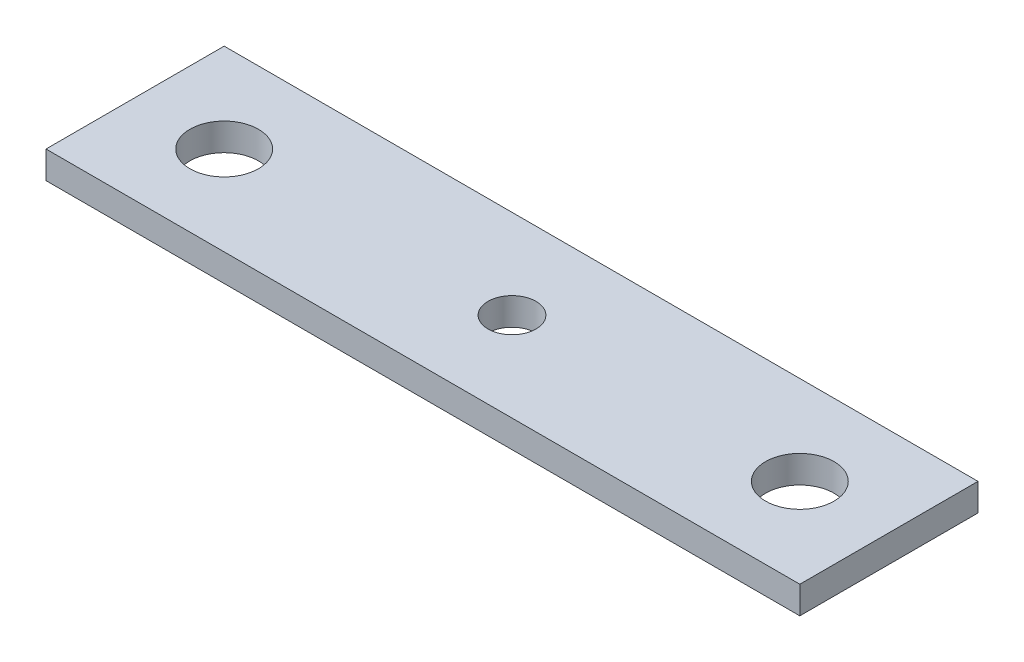
ISO-10303-21;
HEADER;
FILE_DESCRIPTION(('STEP AP214'),'2;1');
FILE_NAME('part.step','',(''),(''),'','','');
FILE_SCHEMA(('AUTOMOTIVE_DESIGN { 1 0 10303 214 1 1 1 1 }'));
ENDSEC;
DATA;
#1=APPLICATION_CONTEXT('core data for automotive mechanical design processes');
#2=APPLICATION_PROTOCOL_DEFINITION('international standard','automotive_design',2000,#1);
#3=PRODUCT_CONTEXT('',#1,'mechanical');
#4=PRODUCT('Part','Part','',(#3));
#5=PRODUCT_RELATED_PRODUCT_CATEGORY('part','',(#4));
#6=PRODUCT_DEFINITION_FORMATION('','',#4);
#7=PRODUCT_DEFINITION_CONTEXT('part definition',#1,'design');
#8=PRODUCT_DEFINITION('design','',#6,#7);
#9=PRODUCT_DEFINITION_SHAPE('','',#8);
#10=(LENGTH_UNIT() NAMED_UNIT(*) SI_UNIT(.MILLI.,.METRE.));
#11=(NAMED_UNIT(*) PLANE_ANGLE_UNIT() SI_UNIT($,.RADIAN.));
#12=(NAMED_UNIT(*) SI_UNIT($,.STERADIAN.) SOLID_ANGLE_UNIT());
#13=UNCERTAINTY_MEASURE_WITH_UNIT(LENGTH_MEASURE(1.E-05),#10,'distance_accuracy_value','');
#14=(GEOMETRIC_REPRESENTATION_CONTEXT(3) GLOBAL_UNCERTAINTY_ASSIGNED_CONTEXT((#13)) GLOBAL_UNIT_ASSIGNED_CONTEXT((#10,
#11,#12)) REPRESENTATION_CONTEXT('',''));
#15=CARTESIAN_POINT('',(0.,0.,0.));
#16=DIRECTION('',(0.,0.,1.));
#17=DIRECTION('',(1.,0.,0.));
#18=AXIS2_PLACEMENT_3D('',#15,#16,#17);
#19=CARTESIAN_POINT('',(0.,2.,0.));
#20=DIRECTION('',(0.,1.,0.));
#21=DIRECTION('',(0.,0.,1.));
#22=AXIS2_PLACEMENT_3D('',#19,#20,#21);
#23=PLANE('',#22);
#24=CARTESIAN_POINT('',(21.,2.,0.));
#25=DIRECTION('',(0.,1.,0.));
#26=DIRECTION('',(0.,0.,1.));
#27=AXIS2_PLACEMENT_3D('',#24,#25,#26);
#28=CIRCLE('',#27,2.5);
#29=CARTESIAN_POINT('',(21.,2.,2.5));
#30=VERTEX_POINT('',#29);
#31=EDGE_CURVE('E138',#30,#30,#28,.T.);
#32=ORIENTED_EDGE('',*,*,#31,.F.);
#33=EDGE_LOOP('',(#32));
#34=FACE_BOUND('',#33,.T.);
#35=DIRECTION('',(0.,0.,-1.));
#36=VECTOR('',#35,1.);
#37=CARTESIAN_POINT('',(27.5,2.,-6.5));
#38=LINE('',#37,#36);
#39=CARTESIAN_POINT('',(27.5,2.,6.5));
#40=VERTEX_POINT('',#39);
#41=CARTESIAN_POINT('',(27.5,2.,-6.5));
#42=VERTEX_POINT('',#41);
#43=EDGE_CURVE('E96',#40,#42,#38,.T.);
#44=ORIENTED_EDGE('',*,*,#43,.T.);
#45=DIRECTION('',(-1.,0.,0.));
#46=VECTOR('',#45,1.);
#47=CARTESIAN_POINT('',(-27.5,2.,-6.5));
#48=LINE('',#47,#46);
#49=CARTESIAN_POINT('',(-27.5,2.,-6.5));
#50=VERTEX_POINT('',#49);
#51=EDGE_CURVE('E91',#42,#50,#48,.T.);
#52=ORIENTED_EDGE('',*,*,#51,.T.);
#53=DIRECTION('',(0.,0.,1.));
#54=VECTOR('',#53,1.);
#55=CARTESIAN_POINT('',(-27.5,2.,-6.5));
#56=LINE('',#55,#54);
#57=CARTESIAN_POINT('',(-27.5,2.,6.5));
#58=VERTEX_POINT('',#57);
#59=EDGE_CURVE('E94',#50,#58,#56,.T.);
#60=ORIENTED_EDGE('',*,*,#59,.T.);
#61=DIRECTION('',(1.,0.,0.));
#62=VECTOR('',#61,1.);
#63=CARTESIAN_POINT('',(-27.5,2.,6.5));
#64=LINE('',#63,#62);
#65=EDGE_CURVE('E61',#58,#40,#64,.T.);
#66=ORIENTED_EDGE('',*,*,#65,.T.);
#67=EDGE_LOOP('',(#44,#52,#60,#66));
#68=FACE_BOUND('',#67,.T.);
#69=CARTESIAN_POINT('',(-21.,2.,0.));
#70=DIRECTION('',(0.,1.,0.));
#71=DIRECTION('',(0.,0.,1.));
#72=AXIS2_PLACEMENT_3D('',#69,#70,#71);
#73=CIRCLE('',#72,2.5);
#74=CARTESIAN_POINT('',(-21.,2.,2.5));
#75=VERTEX_POINT('',#74);
#76=EDGE_CURVE('E116',#75,#75,#73,.T.);
#77=ORIENTED_EDGE('',*,*,#76,.F.);
#78=EDGE_LOOP('',(#77));
#79=FACE_BOUND('',#78,.T.);
#80=CARTESIAN_POINT('',(0.,2.,0.));
#81=DIRECTION('',(0.,1.,0.));
#82=DIRECTION('',(0.,0.,1.));
#83=AXIS2_PLACEMENT_3D('',#80,#81,#82);
#84=CIRCLE('',#83,1.75);
#85=CARTESIAN_POINT('',(0.,2.,1.75));
#86=VERTEX_POINT('',#85);
#87=EDGE_CURVE('E146',#86,#86,#84,.T.);
#88=ORIENTED_EDGE('',*,*,#87,.F.);
#89=EDGE_LOOP('',(#88));
#90=FACE_BOUND('',#89,.T.);
#91=ADVANCED_FACE('F43',(#34,#68,#79,#90),#23,.T.);
#92=CARTESIAN_POINT('',(0.,0.,0.));
#93=DIRECTION('',(0.,1.,0.));
#94=DIRECTION('',(0.,0.,1.));
#95=AXIS2_PLACEMENT_3D('',#92,#93,#94);
#96=PLANE('',#95);
#97=DIRECTION('',(0.,0.,-1.));
#98=VECTOR('',#97,1.);
#99=CARTESIAN_POINT('',(27.5,0.,-6.5));
#100=LINE('',#99,#98);
#101=CARTESIAN_POINT('',(27.5,0.,6.5));
#102=VERTEX_POINT('',#101);
#103=CARTESIAN_POINT('',(27.5,0.,-6.5));
#104=VERTEX_POINT('',#103);
#105=EDGE_CURVE('E112',#102,#104,#100,.T.);
#106=ORIENTED_EDGE('',*,*,#105,.F.);
#107=DIRECTION('',(1.,0.,0.));
#108=VECTOR('',#107,1.);
#109=CARTESIAN_POINT('',(-27.5,0.,6.5));
#110=LINE('',#109,#108);
#111=CARTESIAN_POINT('',(-27.5,0.,6.5));
#112=VERTEX_POINT('',#111);
#113=EDGE_CURVE('E84',#112,#102,#110,.T.);
#114=ORIENTED_EDGE('',*,*,#113,.F.);
#115=DIRECTION('',(0.,0.,1.));
#116=VECTOR('',#115,1.);
#117=CARTESIAN_POINT('',(-27.5,0.,-6.5));
#118=LINE('',#117,#116);
#119=CARTESIAN_POINT('',(-27.5,0.,-6.5));
#120=VERTEX_POINT('',#119);
#121=EDGE_CURVE('E78',#120,#112,#118,.T.);
#122=ORIENTED_EDGE('',*,*,#121,.F.);
#123=DIRECTION('',(-1.,0.,0.));
#124=VECTOR('',#123,1.);
#125=CARTESIAN_POINT('',(-27.5,0.,-6.5));
#126=LINE('',#125,#124);
#127=EDGE_CURVE('E101',#104,#120,#126,.T.);
#128=ORIENTED_EDGE('',*,*,#127,.F.);
#129=EDGE_LOOP('',(#106,#114,#122,#128));
#130=FACE_BOUND('',#129,.T.);
#131=CARTESIAN_POINT('',(-21.,0.,0.));
#132=DIRECTION('',(0.,1.,0.));
#133=DIRECTION('',(0.,0.,1.));
#134=AXIS2_PLACEMENT_3D('',#131,#132,#133);
#135=CIRCLE('',#134,2.5);
#136=CARTESIAN_POINT('',(-21.,0.,2.5));
#137=VERTEX_POINT('',#136);
#138=EDGE_CURVE('E134',#137,#137,#135,.T.);
#139=ORIENTED_EDGE('',*,*,#138,.T.);
#140=EDGE_LOOP('',(#139));
#141=FACE_BOUND('',#140,.T.);
#142=CARTESIAN_POINT('',(21.,0.,0.));
#143=DIRECTION('',(0.,1.,0.));
#144=DIRECTION('',(0.,0.,1.));
#145=AXIS2_PLACEMENT_3D('',#142,#143,#144);
#146=CIRCLE('',#145,2.5);
#147=CARTESIAN_POINT('',(21.,0.,2.5));
#148=VERTEX_POINT('',#147);
#149=EDGE_CURVE('E142',#148,#148,#146,.T.);
#150=ORIENTED_EDGE('',*,*,#149,.T.);
#151=EDGE_LOOP('',(#150));
#152=FACE_BOUND('',#151,.T.);
#153=CARTESIAN_POINT('',(0.,0.,0.));
#154=DIRECTION('',(0.,1.,0.));
#155=DIRECTION('',(0.,0.,1.));
#156=AXIS2_PLACEMENT_3D('',#153,#154,#155);
#157=CIRCLE('',#156,1.75);
#158=CARTESIAN_POINT('',(0.,0.,1.75));
#159=VERTEX_POINT('',#158);
#160=EDGE_CURVE('E150',#159,#159,#157,.T.);
#161=ORIENTED_EDGE('',*,*,#160,.T.);
#162=EDGE_LOOP('',(#161));
#163=FACE_BOUND('',#162,.T.);
#164=ADVANCED_FACE('F129',(#130,#141,#152,#163),#96,.F.);
#165=CARTESIAN_POINT('',(27.5,2.,-6.5));
#166=DIRECTION('',(-1.,0.,0.));
#167=DIRECTION('',(0.,0.,1.));
#168=AXIS2_PLACEMENT_3D('',#165,#166,#167);
#169=PLANE('',#168);
#170=ORIENTED_EDGE('',*,*,#105,.T.);
#171=DIRECTION('',(0.,-1.,0.));
#172=VECTOR('',#171,1.);
#173=CARTESIAN_POINT('',(27.5,2.,-6.5));
#174=LINE('',#173,#172);
#175=EDGE_CURVE('E11',#42,#104,#174,.T.);
#176=ORIENTED_EDGE('',*,*,#175,.F.);
#177=ORIENTED_EDGE('',*,*,#43,.F.);
#178=DIRECTION('',(0.,-1.,0.));
#179=VECTOR('',#178,1.);
#180=CARTESIAN_POINT('',(27.5,2.,6.5));
#181=LINE('',#180,#179);
#182=EDGE_CURVE('E108',#40,#102,#181,.T.);
#183=ORIENTED_EDGE('',*,*,#182,.T.);
#184=EDGE_LOOP('',(#170,#176,#177,#183));
#185=FACE_BOUND('',#184,.T.);
#186=ADVANCED_FACE('F45',(#185),#169,.F.);
#187=CARTESIAN_POINT('',(-27.5,2.,-6.5));
#188=DIRECTION('',(0.,0.,1.));
#189=DIRECTION('',(1.,0.,0.));
#190=AXIS2_PLACEMENT_3D('',#187,#188,#189);
#191=PLANE('',#190);
#192=ORIENTED_EDGE('',*,*,#127,.T.);
#193=DIRECTION('',(0.,-1.,0.));
#194=VECTOR('',#193,1.);
#195=CARTESIAN_POINT('',(-27.5,2.,-6.5));
#196=LINE('',#195,#194);
#197=EDGE_CURVE('E53',#50,#120,#196,.T.);
#198=ORIENTED_EDGE('',*,*,#197,.F.);
#199=ORIENTED_EDGE('',*,*,#51,.F.);
#200=ORIENTED_EDGE('',*,*,#175,.T.);
#201=EDGE_LOOP('',(#192,#198,#199,#200));
#202=FACE_BOUND('',#201,.T.);
#203=ADVANCED_FACE('F100',(#202),#191,.F.);
#204=CARTESIAN_POINT('',(-27.5,2.,-6.5));
#205=DIRECTION('',(1.,0.,0.));
#206=DIRECTION('',(0.,0.,-1.));
#207=AXIS2_PLACEMENT_3D('',#204,#205,#206);
#208=PLANE('',#207);
#209=ORIENTED_EDGE('',*,*,#121,.T.);
#210=DIRECTION('',(0.,-1.,0.));
#211=VECTOR('',#210,1.);
#212=CARTESIAN_POINT('',(-27.5,2.,6.5));
#213=LINE('',#212,#211);
#214=EDGE_CURVE('E103',#58,#112,#213,.T.);
#215=ORIENTED_EDGE('',*,*,#214,.F.);
#216=ORIENTED_EDGE('',*,*,#59,.F.);
#217=ORIENTED_EDGE('',*,*,#197,.T.);
#218=EDGE_LOOP('',(#209,#215,#216,#217));
#219=FACE_BOUND('',#218,.T.);
#220=ADVANCED_FACE('F104',(#219),#208,.F.);
#221=CARTESIAN_POINT('',(-27.5,2.,6.5));
#222=DIRECTION('',(0.,0.,-1.));
#223=DIRECTION('',(-1.,0.,0.));
#224=AXIS2_PLACEMENT_3D('',#221,#222,#223);
#225=PLANE('',#224);
#226=ORIENTED_EDGE('',*,*,#113,.T.);
#227=ORIENTED_EDGE('',*,*,#182,.F.);
#228=ORIENTED_EDGE('',*,*,#65,.F.);
#229=ORIENTED_EDGE('',*,*,#214,.T.);
#230=EDGE_LOOP('',(#226,#227,#228,#229));
#231=FACE_BOUND('',#230,.T.);
#232=ADVANCED_FACE('F126',(#231),#225,.F.);
#233=CARTESIAN_POINT('',(-21.,2.,0.));
#234=DIRECTION('',(0.,-1.,0.));
#235=DIRECTION('',(0.,0.,-1.));
#236=AXIS2_PLACEMENT_3D('',#233,#234,#235);
#237=CYLINDRICAL_SURFACE('',#236,2.5);
#238=ORIENTED_EDGE('',*,*,#76,.T.);
#239=EDGE_LOOP('',(#238));
#240=FACE_BOUND('',#239,.T.);
#241=ORIENTED_EDGE('',*,*,#138,.F.);
#242=EDGE_LOOP('',(#241));
#243=FACE_BOUND('',#242,.T.);
#244=ADVANCED_FACE('F170',(#240,#243),#237,.F.);
#245=CARTESIAN_POINT('',(21.,2.,0.));
#246=DIRECTION('',(0.,-1.,0.));
#247=DIRECTION('',(0.,0.,-1.));
#248=AXIS2_PLACEMENT_3D('',#245,#246,#247);
#249=CYLINDRICAL_SURFACE('',#248,2.5);
#250=ORIENTED_EDGE('',*,*,#31,.T.);
#251=EDGE_LOOP('',(#250));
#252=FACE_BOUND('',#251,.T.);
#253=ORIENTED_EDGE('',*,*,#149,.F.);
#254=EDGE_LOOP('',(#253));
#255=FACE_BOUND('',#254,.T.);
#256=ADVANCED_FACE('F224',(#252,#255),#249,.F.);
#257=CARTESIAN_POINT('',(0.,2.,0.));
#258=DIRECTION('',(0.,-1.,0.));
#259=DIRECTION('',(0.,0.,-1.));
#260=AXIS2_PLACEMENT_3D('',#257,#258,#259);
#261=CYLINDRICAL_SURFACE('',#260,1.75);
#262=ORIENTED_EDGE('',*,*,#87,.T.);
#263=EDGE_LOOP('',(#262));
#264=FACE_BOUND('',#263,.T.);
#265=ORIENTED_EDGE('',*,*,#160,.F.);
#266=EDGE_LOOP('',(#265));
#267=FACE_BOUND('',#266,.T.);
#268=ADVANCED_FACE('F158',(#264,#267),#261,.F.);
#269=CLOSED_SHELL('',(#91,#164,#186,#203,#220,#232,#244,#256,#268));
#270=MANIFOLD_SOLID_BREP('B2',#269);
#271=ADVANCED_BREP_SHAPE_REPRESENTATION('',(#18,#270),#14);
#272=SHAPE_DEFINITION_REPRESENTATION(#9,#271);
ENDSEC;
END-ISO-10303-21;
